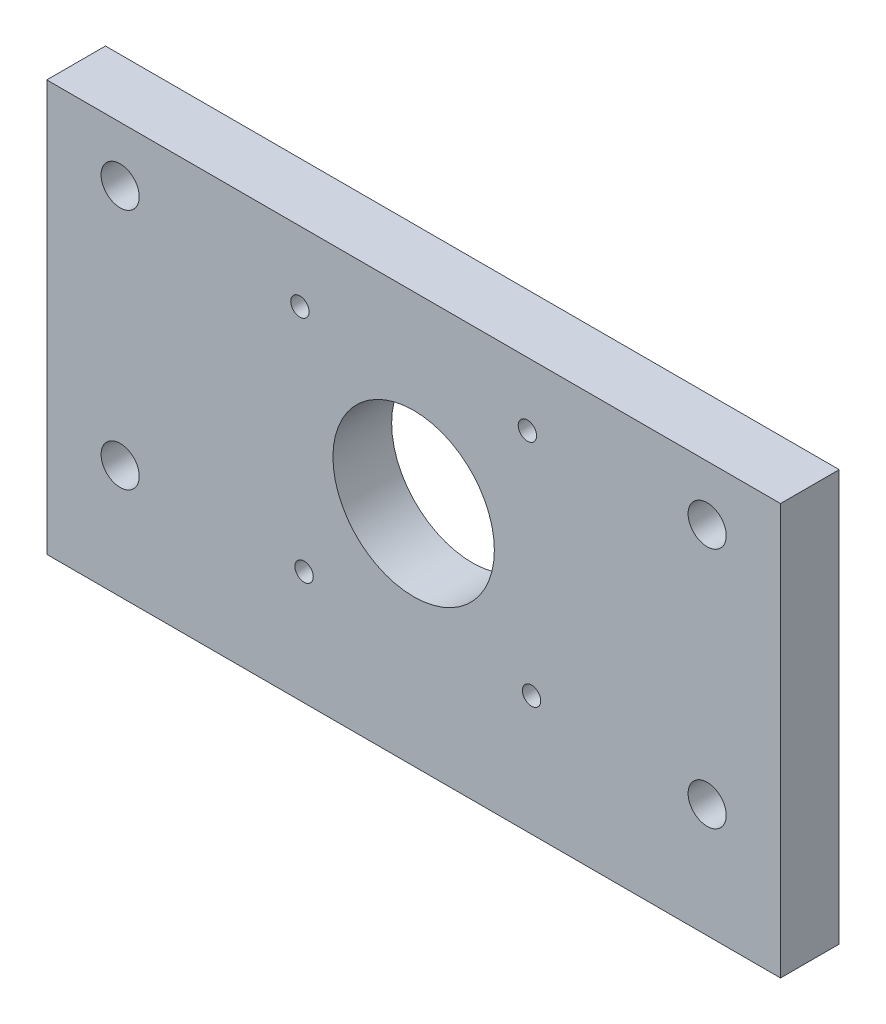
ISO-10303-21;
HEADER;
FILE_DESCRIPTION(('STEP AP214'),'2;1');
FILE_NAME('part.step','',(''),(''),'','','');
FILE_SCHEMA(('AUTOMOTIVE_DESIGN { 1 0 10303 214 1 1 1 1 }'));
ENDSEC;
DATA;
#1=APPLICATION_CONTEXT('core data for automotive mechanical design processes');
#2=APPLICATION_PROTOCOL_DEFINITION('international standard','automotive_design',2000,#1);
#3=PRODUCT_CONTEXT('',#1,'mechanical');
#4=PRODUCT('Part','Part','',(#3));
#5=PRODUCT_RELATED_PRODUCT_CATEGORY('part','',(#4));
#6=PRODUCT_DEFINITION_FORMATION('','',#4);
#7=PRODUCT_DEFINITION_CONTEXT('part definition',#1,'design');
#8=PRODUCT_DEFINITION('design','',#6,#7);
#9=PRODUCT_DEFINITION_SHAPE('','',#8);
#10=(LENGTH_UNIT() NAMED_UNIT(*) SI_UNIT(.MILLI.,.METRE.));
#11=(NAMED_UNIT(*) PLANE_ANGLE_UNIT() SI_UNIT($,.RADIAN.));
#12=(NAMED_UNIT(*) SI_UNIT($,.STERADIAN.) SOLID_ANGLE_UNIT());
#13=UNCERTAINTY_MEASURE_WITH_UNIT(LENGTH_MEASURE(1.E-05),#10,'distance_accuracy_value','');
#14=(GEOMETRIC_REPRESENTATION_CONTEXT(3) GLOBAL_UNCERTAINTY_ASSIGNED_CONTEXT((#13)) GLOBAL_UNIT_ASSIGNED_CONTEXT((#10,
#11,#12)) REPRESENTATION_CONTEXT('',''));
#15=CARTESIAN_POINT('',(0.,0.,0.));
#16=DIRECTION('',(0.,0.,1.));
#17=DIRECTION('',(1.,0.,0.));
#18=AXIS2_PLACEMENT_3D('',#15,#16,#17);
#19=CARTESIAN_POINT('',(0.,0.,8.));
#20=DIRECTION('',(0.,0.,1.));
#21=DIRECTION('',(1.,0.,0.));
#22=AXIS2_PLACEMENT_3D('',#19,#20,#21);
#23=PLANE('',#22);
#24=CARTESIAN_POINT('',(-32.6220828412006,-13.5297723292469,8.));
#25=DIRECTION('',(0.,0.,1.));
#26=DIRECTION('',(1.,0.,0.));
#27=AXIS2_PLACEMENT_3D('',#24,#25,#26);
#28=CIRCLE('',#27,2.59999999999998);
#29=CARTESIAN_POINT('',(-30.0220828412007,-13.5297723292469,8.));
#30=VERTEX_POINT('',#29);
#31=EDGE_CURVE('E306',#30,#30,#28,.T.);
#32=ORIENTED_EDGE('',*,*,#31,.F.);
#33=EDGE_LOOP('',(#32));
#34=FACE_BOUND('',#33,.T.);
#35=CARTESIAN_POINT('',(47.3779171587994,-13.5297723292469,8.));
#36=DIRECTION('',(0.,0.,1.));
#37=DIRECTION('',(1.,0.,0.));
#38=AXIS2_PLACEMENT_3D('',#35,#36,#37);
#39=CIRCLE('',#38,2.59999999999999);
#40=CARTESIAN_POINT('',(49.9779171587994,-13.5297723292469,8.));
#41=VERTEX_POINT('',#40);
#42=EDGE_CURVE('E309',#41,#41,#39,.T.);
#43=ORIENTED_EDGE('',*,*,#42,.F.);
#44=EDGE_LOOP('',(#43));
#45=FACE_BOUND('',#44,.T.);
#46=CARTESIAN_POINT('',(47.3779171587994,19.4702276707531,8.));
#47=DIRECTION('',(0.,0.,1.));
#48=DIRECTION('',(1.,0.,0.));
#49=AXIS2_PLACEMENT_3D('',#46,#47,#48);
#50=CIRCLE('',#49,2.59999999999999);
#51=CARTESIAN_POINT('',(49.9779171587994,19.4702276707531,8.));
#52=VERTEX_POINT('',#51);
#53=EDGE_CURVE('E288',#52,#52,#50,.T.);
#54=ORIENTED_EDGE('',*,*,#53,.F.);
#55=EDGE_LOOP('',(#54));
#56=FACE_BOUND('',#55,.T.);
#57=CARTESIAN_POINT('',(-32.6220828412006,19.4702276707531,8.));
#58=DIRECTION('',(0.,0.,1.));
#59=DIRECTION('',(1.,0.,0.));
#60=AXIS2_PLACEMENT_3D('',#57,#58,#59);
#61=CIRCLE('',#60,2.59999999999998);
#62=CARTESIAN_POINT('',(-30.0220828412007,19.4702276707531,8.));
#63=VERTEX_POINT('',#62);
#64=EDGE_CURVE('E112',#63,#63,#61,.T.);
#65=ORIENTED_EDGE('',*,*,#64,.F.);
#66=EDGE_LOOP('',(#65));
#67=FACE_BOUND('',#66,.T.);
#68=CARTESIAN_POINT('',(22.8779171587994,18.329910511326,8.));
#69=DIRECTION('',(0.,0.,1.));
#70=DIRECTION('',(1.,0.,0.));
#71=AXIS2_PLACEMENT_3D('',#68,#69,#70);
#72=CIRCLE('',#71,1.24999999999999);
#73=CARTESIAN_POINT('',(24.1279171587994,18.329910511326,8.));
#74=VERTEX_POINT('',#73);
#75=EDGE_CURVE('E102',#74,#74,#72,.T.);
#76=ORIENTED_EDGE('',*,*,#75,.F.);
#77=EDGE_LOOP('',(#76));
#78=FACE_BOUND('',#77,.T.);
#79=CARTESIAN_POINT('',(23.4466022773196,-12.670089488674,8.));
#80=DIRECTION('',(0.,0.,1.));
#81=DIRECTION('',(1.,0.,0.));
#82=AXIS2_PLACEMENT_3D('',#79,#80,#81);
#83=CIRCLE('',#82,1.24999999999999);
#84=CARTESIAN_POINT('',(24.6966022773195,-12.670089488674,8.));
#85=VERTEX_POINT('',#84);
#86=EDGE_CURVE('E145',#85,#85,#83,.T.);
#87=ORIENTED_EDGE('',*,*,#86,.F.);
#88=EDGE_LOOP('',(#87));
#89=FACE_BOUND('',#88,.T.);
#90=CARTESIAN_POINT('',(-7.55339772268045,-13.5297723292469,8.));
#91=DIRECTION('',(0.,0.,1.));
#92=DIRECTION('',(1.,0.,0.));
#93=AXIS2_PLACEMENT_3D('',#90,#91,#92);
#94=CIRCLE('',#93,1.24999999999999);
#95=CARTESIAN_POINT('',(-6.30339772268046,-13.5297723292469,8.));
#96=VERTEX_POINT('',#95);
#97=EDGE_CURVE('E142',#96,#96,#94,.T.);
#98=ORIENTED_EDGE('',*,*,#97,.F.);
#99=EDGE_LOOP('',(#98));
#100=FACE_BOUND('',#99,.T.);
#101=CARTESIAN_POINT('',(-8.12208284120064,17.4702276707531,8.));
#102=DIRECTION('',(0.,0.,1.));
#103=DIRECTION('',(1.,0.,0.));
#104=AXIS2_PLACEMENT_3D('',#101,#102,#103);
#105=CIRCLE('',#104,1.24999999999999);
#106=CARTESIAN_POINT('',(-6.87208284120065,17.4702276707531,8.));
#107=VERTEX_POINT('',#106);
#108=EDGE_CURVE('E139',#107,#107,#105,.T.);
#109=ORIENTED_EDGE('',*,*,#108,.F.);
#110=EDGE_LOOP('',(#109));
#111=FACE_BOUND('',#110,.T.);
#112=CARTESIAN_POINT('',(7.37791715879936,1.97022767075305,8.));
#113=DIRECTION('',(0.,0.,1.));
#114=DIRECTION('',(1.,0.,0.));
#115=AXIS2_PLACEMENT_3D('',#112,#113,#114);
#116=CIRCLE('',#115,11.);
#117=CARTESIAN_POINT('',(18.3779171587994,1.97022767075305,8.));
#118=VERTEX_POINT('',#117);
#119=EDGE_CURVE('E135',#118,#118,#116,.T.);
#120=ORIENTED_EDGE('',*,*,#119,.F.);
#121=EDGE_LOOP('',(#120));
#122=FACE_BOUND('',#121,.T.);
#123=DIRECTION('',(0.,-1.,0.));
#124=VECTOR('',#123,1.);
#125=CARTESIAN_POINT('',(-42.6220828412006,26.9702276707531,8.));
#126=LINE('',#125,#124);
#127=CARTESIAN_POINT('',(-42.6220828412006,26.9702276707531,8.));
#128=VERTEX_POINT('',#127);
#129=CARTESIAN_POINT('',(-42.6220828412006,-29.0297723292469,8.));
#130=VERTEX_POINT('',#129);
#131=EDGE_CURVE('E86',#128,#130,#126,.T.);
#132=ORIENTED_EDGE('',*,*,#131,.T.);
#133=DIRECTION('',(1.,0.,0.));
#134=VECTOR('',#133,1.);
#135=CARTESIAN_POINT('',(-42.6220828412006,-29.0297723292469,8.));
#136=LINE('',#135,#134);
#137=CARTESIAN_POINT('',(57.3779171587994,-29.0297723292469,8.));
#138=VERTEX_POINT('',#137);
#139=EDGE_CURVE('E82',#130,#138,#136,.T.);
#140=ORIENTED_EDGE('',*,*,#139,.T.);
#141=DIRECTION('',(0.,1.,0.));
#142=VECTOR('',#141,1.);
#143=CARTESIAN_POINT('',(57.3779171587994,26.9702276707531,8.));
#144=LINE('',#143,#142);
#145=CARTESIAN_POINT('',(57.3779171587994,26.9702276707531,8.));
#146=VERTEX_POINT('',#145);
#147=EDGE_CURVE('E84',#138,#146,#144,.T.);
#148=ORIENTED_EDGE('',*,*,#147,.T.);
#149=DIRECTION('',(-1.,0.,0.));
#150=VECTOR('',#149,1.);
#151=CARTESIAN_POINT('',(-42.6220828412006,26.9702276707531,8.));
#152=LINE('',#151,#150);
#153=EDGE_CURVE('E52',#146,#128,#152,.T.);
#154=ORIENTED_EDGE('',*,*,#153,.T.);
#155=EDGE_LOOP('',(#132,#140,#148,#154));
#156=FACE_BOUND('',#155,.T.);
#157=ADVANCED_FACE('F33',(#34,#45,#56,#67,#78,#89,#100,#111,#122,#156),#23,.T.);
#158=CARTESIAN_POINT('',(0.,0.,0.));
#159=DIRECTION('',(0.,0.,1.));
#160=DIRECTION('',(1.,0.,0.));
#161=AXIS2_PLACEMENT_3D('',#158,#159,#160);
#162=PLANE('',#161);
#163=CARTESIAN_POINT('',(-32.6220828412006,-13.5297723292469,0.));
#164=DIRECTION('',(0.,0.,1.));
#165=DIRECTION('',(1.,0.,0.));
#166=AXIS2_PLACEMENT_3D('',#163,#164,#165);
#167=CIRCLE('',#166,2.59999999999998);
#168=CARTESIAN_POINT('',(-30.0220828412007,-13.5297723292469,0.));
#169=VERTEX_POINT('',#168);
#170=EDGE_CURVE('E37',#169,#169,#167,.T.);
#171=ORIENTED_EDGE('',*,*,#170,.T.);
#172=EDGE_LOOP('',(#171));
#173=FACE_BOUND('',#172,.T.);
#174=CARTESIAN_POINT('',(47.3779171587994,-13.5297723292469,0.));
#175=DIRECTION('',(0.,0.,1.));
#176=DIRECTION('',(1.,0.,0.));
#177=AXIS2_PLACEMENT_3D('',#174,#175,#176);
#178=CIRCLE('',#177,2.59999999999999);
#179=CARTESIAN_POINT('',(49.9779171587994,-13.5297723292469,0.));
#180=VERTEX_POINT('',#179);
#181=EDGE_CURVE('E114',#180,#180,#178,.T.);
#182=ORIENTED_EDGE('',*,*,#181,.T.);
#183=EDGE_LOOP('',(#182));
#184=FACE_BOUND('',#183,.T.);
#185=CARTESIAN_POINT('',(47.3779171587994,19.4702276707531,0.));
#186=DIRECTION('',(0.,0.,1.));
#187=DIRECTION('',(1.,0.,0.));
#188=AXIS2_PLACEMENT_3D('',#185,#186,#187);
#189=CIRCLE('',#188,2.59999999999999);
#190=CARTESIAN_POINT('',(49.9779171587994,19.4702276707531,0.));
#191=VERTEX_POINT('',#190);
#192=EDGE_CURVE('E111',#191,#191,#189,.T.);
#193=ORIENTED_EDGE('',*,*,#192,.T.);
#194=EDGE_LOOP('',(#193));
#195=FACE_BOUND('',#194,.T.);
#196=CARTESIAN_POINT('',(-32.6220828412006,19.4702276707531,0.));
#197=DIRECTION('',(0.,0.,1.));
#198=DIRECTION('',(1.,0.,0.));
#199=AXIS2_PLACEMENT_3D('',#196,#197,#198);
#200=CIRCLE('',#199,2.59999999999998);
#201=CARTESIAN_POINT('',(-30.0220828412007,19.4702276707531,0.));
#202=VERTEX_POINT('',#201);
#203=EDGE_CURVE('E108',#202,#202,#200,.T.);
#204=ORIENTED_EDGE('',*,*,#203,.T.);
#205=EDGE_LOOP('',(#204));
#206=FACE_BOUND('',#205,.T.);
#207=CARTESIAN_POINT('',(22.8779171587994,18.329910511326,0.));
#208=DIRECTION('',(0.,0.,-1.));
#209=DIRECTION('',(-1.,0.,0.));
#210=AXIS2_PLACEMENT_3D('',#207,#208,#209);
#211=CIRCLE('',#210,1.24999999999999);
#212=CARTESIAN_POINT('',(21.6279171587994,18.329910511326,0.));
#213=VERTEX_POINT('',#212);
#214=EDGE_CURVE('E119',#213,#213,#211,.T.);
#215=ORIENTED_EDGE('',*,*,#214,.F.);
#216=EDGE_LOOP('',(#215));
#217=FACE_BOUND('',#216,.T.);
#218=CARTESIAN_POINT('',(23.4466022773196,-12.670089488674,0.));
#219=DIRECTION('',(0.,0.,-1.));
#220=DIRECTION('',(-1.,0.,0.));
#221=AXIS2_PLACEMENT_3D('',#218,#219,#220);
#222=CIRCLE('',#221,1.24999999999999);
#223=CARTESIAN_POINT('',(22.1966022773196,-12.670089488674,0.));
#224=VERTEX_POINT('',#223);
#225=EDGE_CURVE('E123',#224,#224,#222,.T.);
#226=ORIENTED_EDGE('',*,*,#225,.F.);
#227=EDGE_LOOP('',(#226));
#228=FACE_BOUND('',#227,.T.);
#229=CARTESIAN_POINT('',(-7.55339772268045,-13.5297723292469,0.));
#230=DIRECTION('',(0.,0.,-1.));
#231=DIRECTION('',(-1.,0.,0.));
#232=AXIS2_PLACEMENT_3D('',#229,#230,#231);
#233=CIRCLE('',#232,1.24999999999999);
#234=CARTESIAN_POINT('',(-8.80339772268044,-13.5297723292469,0.));
#235=VERTEX_POINT('',#234);
#236=EDGE_CURVE('E128',#235,#235,#233,.T.);
#237=ORIENTED_EDGE('',*,*,#236,.F.);
#238=EDGE_LOOP('',(#237));
#239=FACE_BOUND('',#238,.T.);
#240=CARTESIAN_POINT('',(-8.12208284120064,17.4702276707531,0.));
#241=DIRECTION('',(0.,0.,-1.));
#242=DIRECTION('',(-1.,0.,0.));
#243=AXIS2_PLACEMENT_3D('',#240,#241,#242);
#244=CIRCLE('',#243,1.24999999999999);
#245=CARTESIAN_POINT('',(-9.37208284120063,17.4702276707531,0.));
#246=VERTEX_POINT('',#245);
#247=EDGE_CURVE('E136',#246,#246,#244,.T.);
#248=ORIENTED_EDGE('',*,*,#247,.F.);
#249=EDGE_LOOP('',(#248));
#250=FACE_BOUND('',#249,.T.);
#251=CARTESIAN_POINT('',(7.37791715879936,1.97022767075305,0.));
#252=DIRECTION('',(0.,0.,-1.));
#253=DIRECTION('',(-1.,0.,0.));
#254=AXIS2_PLACEMENT_3D('',#251,#252,#253);
#255=CIRCLE('',#254,11.);
#256=CARTESIAN_POINT('',(-3.62208284120064,1.97022767075305,0.));
#257=VERTEX_POINT('',#256);
#258=EDGE_CURVE('E132',#257,#257,#255,.T.);
#259=ORIENTED_EDGE('',*,*,#258,.F.);
#260=EDGE_LOOP('',(#259));
#261=FACE_BOUND('',#260,.T.);
#262=DIRECTION('',(0.,-1.,0.));
#263=VECTOR('',#262,1.);
#264=CARTESIAN_POINT('',(-42.6220828412006,26.9702276707531,0.));
#265=LINE('',#264,#263);
#266=CARTESIAN_POINT('',(-42.6220828412006,26.9702276707531,0.));
#267=VERTEX_POINT('',#266);
#268=CARTESIAN_POINT('',(-42.6220828412006,-29.0297723292469,0.));
#269=VERTEX_POINT('',#268);
#270=EDGE_CURVE('E99',#267,#269,#265,.T.);
#271=ORIENTED_EDGE('',*,*,#270,.F.);
#272=DIRECTION('',(-1.,0.,0.));
#273=VECTOR('',#272,1.);
#274=CARTESIAN_POINT('',(-42.6220828412006,26.9702276707531,0.));
#275=LINE('',#274,#273);
#276=CARTESIAN_POINT('',(57.3779171587994,26.9702276707531,0.));
#277=VERTEX_POINT('',#276);
#278=EDGE_CURVE('E75',#277,#267,#275,.T.);
#279=ORIENTED_EDGE('',*,*,#278,.F.);
#280=DIRECTION('',(0.,1.,0.));
#281=VECTOR('',#280,1.);
#282=CARTESIAN_POINT('',(57.3779171587994,26.9702276707531,0.));
#283=LINE('',#282,#281);
#284=CARTESIAN_POINT('',(57.3779171587994,-29.0297723292469,0.));
#285=VERTEX_POINT('',#284);
#286=EDGE_CURVE('E69',#285,#277,#283,.T.);
#287=ORIENTED_EDGE('',*,*,#286,.F.);
#288=DIRECTION('',(1.,0.,0.));
#289=VECTOR('',#288,1.);
#290=CARTESIAN_POINT('',(-42.6220828412006,-29.0297723292469,0.));
#291=LINE('',#290,#289);
#292=EDGE_CURVE('E90',#269,#285,#291,.T.);
#293=ORIENTED_EDGE('',*,*,#292,.F.);
#294=EDGE_LOOP('',(#271,#279,#287,#293));
#295=FACE_BOUND('',#294,.T.);
#296=ADVANCED_FACE('F155',(#173,#184,#195,#206,#217,#228,#239,#250,#261,#295),#162,.F.);
#297=CARTESIAN_POINT('',(-42.6220828412006,26.9702276707531,8.));
#298=DIRECTION('',(1.,0.,0.));
#299=DIRECTION('',(0.,0.,-1.));
#300=AXIS2_PLACEMENT_3D('',#297,#298,#299);
#301=PLANE('',#300);
#302=ORIENTED_EDGE('',*,*,#270,.T.);
#303=DIRECTION('',(0.,0.,-1.));
#304=VECTOR('',#303,1.);
#305=CARTESIAN_POINT('',(-42.6220828412006,-29.0297723292469,8.));
#306=LINE('',#305,#304);
#307=EDGE_CURVE('E11',#130,#269,#306,.T.);
#308=ORIENTED_EDGE('',*,*,#307,.F.);
#309=ORIENTED_EDGE('',*,*,#131,.F.);
#310=DIRECTION('',(0.,0.,-1.));
#311=VECTOR('',#310,1.);
#312=CARTESIAN_POINT('',(-42.6220828412006,26.9702276707531,8.));
#313=LINE('',#312,#311);
#314=EDGE_CURVE('E95',#128,#267,#313,.T.);
#315=ORIENTED_EDGE('',*,*,#314,.T.);
#316=EDGE_LOOP('',(#302,#308,#309,#315));
#317=FACE_BOUND('',#316,.T.);
#318=ADVANCED_FACE('F35',(#317),#301,.F.);
#319=CARTESIAN_POINT('',(-42.6220828412006,-29.0297723292469,8.));
#320=DIRECTION('',(0.,1.,0.));
#321=DIRECTION('',(0.,0.,1.));
#322=AXIS2_PLACEMENT_3D('',#319,#320,#321);
#323=PLANE('',#322);
#324=ORIENTED_EDGE('',*,*,#292,.T.);
#325=DIRECTION('',(0.,0.,-1.));
#326=VECTOR('',#325,1.);
#327=CARTESIAN_POINT('',(57.3779171587994,-29.0297723292469,8.));
#328=LINE('',#327,#326);
#329=EDGE_CURVE('E43',#138,#285,#328,.T.);
#330=ORIENTED_EDGE('',*,*,#329,.F.);
#331=ORIENTED_EDGE('',*,*,#139,.F.);
#332=ORIENTED_EDGE('',*,*,#307,.T.);
#333=EDGE_LOOP('',(#324,#330,#331,#332));
#334=FACE_BOUND('',#333,.T.);
#335=ADVANCED_FACE('F89',(#334),#323,.F.);
#336=CARTESIAN_POINT('',(57.3779171587994,26.9702276707531,8.));
#337=DIRECTION('',(-1.,0.,0.));
#338=DIRECTION('',(0.,-1.,0.));
#339=AXIS2_PLACEMENT_3D('',#336,#337,#338);
#340=PLANE('',#339);
#341=ORIENTED_EDGE('',*,*,#286,.T.);
#342=DIRECTION('',(0.,0.,-1.));
#343=VECTOR('',#342,1.);
#344=CARTESIAN_POINT('',(57.3779171587994,26.9702276707531,8.));
#345=LINE('',#344,#343);
#346=EDGE_CURVE('E91',#146,#277,#345,.T.);
#347=ORIENTED_EDGE('',*,*,#346,.F.);
#348=ORIENTED_EDGE('',*,*,#147,.F.);
#349=ORIENTED_EDGE('',*,*,#329,.T.);
#350=EDGE_LOOP('',(#341,#347,#348,#349));
#351=FACE_BOUND('',#350,.T.);
#352=ADVANCED_FACE('F93',(#351),#340,.F.);
#353=CARTESIAN_POINT('',(-42.6220828412006,26.9702276707531,8.));
#354=DIRECTION('',(0.,-1.,0.));
#355=DIRECTION('',(0.,0.,-1.));
#356=AXIS2_PLACEMENT_3D('',#353,#354,#355);
#357=PLANE('',#356);
#358=ORIENTED_EDGE('',*,*,#278,.T.);
#359=ORIENTED_EDGE('',*,*,#314,.F.);
#360=ORIENTED_EDGE('',*,*,#153,.F.);
#361=ORIENTED_EDGE('',*,*,#346,.T.);
#362=EDGE_LOOP('',(#358,#359,#360,#361));
#363=FACE_BOUND('',#362,.T.);
#364=ADVANCED_FACE('F170',(#363),#357,.F.);
#365=CARTESIAN_POINT('',(7.37791715879936,1.97022767075305,10.));
#366=DIRECTION('',(0.,0.,-1.));
#367=DIRECTION('',(-1.,0.,0.));
#368=AXIS2_PLACEMENT_3D('',#365,#366,#367);
#369=CYLINDRICAL_SURFACE('',#368,11.);
#370=ORIENTED_EDGE('',*,*,#119,.T.);
#371=EDGE_LOOP('',(#370));
#372=FACE_BOUND('',#371,.T.);
#373=ORIENTED_EDGE('',*,*,#258,.T.);
#374=EDGE_LOOP('',(#373));
#375=FACE_BOUND('',#374,.T.);
#376=ADVANCED_FACE('F166',(#372,#375),#369,.F.);
#377=CARTESIAN_POINT('',(-8.12208284120064,17.4702276707531,10.));
#378=DIRECTION('',(0.,0.,-1.));
#379=DIRECTION('',(-1.,0.,0.));
#380=AXIS2_PLACEMENT_3D('',#377,#378,#379);
#381=CYLINDRICAL_SURFACE('',#380,1.24999999999999);
#382=ORIENTED_EDGE('',*,*,#108,.T.);
#383=EDGE_LOOP('',(#382));
#384=FACE_BOUND('',#383,.T.);
#385=ORIENTED_EDGE('',*,*,#247,.T.);
#386=EDGE_LOOP('',(#385));
#387=FACE_BOUND('',#386,.T.);
#388=ADVANCED_FACE('F169',(#384,#387),#381,.F.);
#389=CARTESIAN_POINT('',(-7.55339772268045,-13.5297723292469,10.));
#390=DIRECTION('',(0.,0.,-1.));
#391=DIRECTION('',(-1.,0.,0.));
#392=AXIS2_PLACEMENT_3D('',#389,#390,#391);
#393=CYLINDRICAL_SURFACE('',#392,1.24999999999999);
#394=ORIENTED_EDGE('',*,*,#97,.T.);
#395=EDGE_LOOP('',(#394));
#396=FACE_BOUND('',#395,.T.);
#397=ORIENTED_EDGE('',*,*,#236,.T.);
#398=EDGE_LOOP('',(#397));
#399=FACE_BOUND('',#398,.T.);
#400=ADVANCED_FACE('F221',(#396,#399),#393,.F.);
#401=CARTESIAN_POINT('',(23.4466022773196,-12.670089488674,10.));
#402=DIRECTION('',(0.,0.,-1.));
#403=DIRECTION('',(-1.,0.,0.));
#404=AXIS2_PLACEMENT_3D('',#401,#402,#403);
#405=CYLINDRICAL_SURFACE('',#404,1.24999999999999);
#406=ORIENTED_EDGE('',*,*,#86,.T.);
#407=EDGE_LOOP('',(#406));
#408=FACE_BOUND('',#407,.T.);
#409=ORIENTED_EDGE('',*,*,#225,.T.);
#410=EDGE_LOOP('',(#409));
#411=FACE_BOUND('',#410,.T.);
#412=ADVANCED_FACE('F210',(#408,#411),#405,.F.);
#413=CARTESIAN_POINT('',(22.8779171587994,18.329910511326,10.));
#414=DIRECTION('',(0.,0.,-1.));
#415=DIRECTION('',(-1.,0.,0.));
#416=AXIS2_PLACEMENT_3D('',#413,#414,#415);
#417=CYLINDRICAL_SURFACE('',#416,1.24999999999999);
#418=ORIENTED_EDGE('',*,*,#75,.T.);
#419=EDGE_LOOP('',(#418));
#420=FACE_BOUND('',#419,.T.);
#421=ORIENTED_EDGE('',*,*,#214,.T.);
#422=EDGE_LOOP('',(#421));
#423=FACE_BOUND('',#422,.T.);
#424=ADVANCED_FACE('F151',(#420,#423),#417,.F.);
#425=CARTESIAN_POINT('',(-32.6220828412006,19.4702276707531,-2.));
#426=DIRECTION('',(0.,0.,1.));
#427=DIRECTION('',(1.,0.,0.));
#428=AXIS2_PLACEMENT_3D('',#425,#426,#427);
#429=CYLINDRICAL_SURFACE('',#428,2.59999999999998);
#430=ORIENTED_EDGE('',*,*,#64,.T.);
#431=EDGE_LOOP('',(#430));
#432=FACE_BOUND('',#431,.T.);
#433=ORIENTED_EDGE('',*,*,#203,.F.);
#434=EDGE_LOOP('',(#433));
#435=FACE_BOUND('',#434,.T.);
#436=ADVANCED_FACE('F209',(#432,#435),#429,.F.);
#437=CARTESIAN_POINT('',(47.3779171587994,19.4702276707531,-2.));
#438=DIRECTION('',(0.,0.,1.));
#439=DIRECTION('',(1.,0.,0.));
#440=AXIS2_PLACEMENT_3D('',#437,#438,#439);
#441=CYLINDRICAL_SURFACE('',#440,2.59999999999999);
#442=ORIENTED_EDGE('',*,*,#53,.T.);
#443=EDGE_LOOP('',(#442));
#444=FACE_BOUND('',#443,.T.);
#445=ORIENTED_EDGE('',*,*,#192,.F.);
#446=EDGE_LOOP('',(#445));
#447=FACE_BOUND('',#446,.T.);
#448=ADVANCED_FACE('F271',(#444,#447),#441,.F.);
#449=CARTESIAN_POINT('',(47.3779171587994,-13.5297723292469,-2.));
#450=DIRECTION('',(0.,0.,1.));
#451=DIRECTION('',(1.,0.,0.));
#452=AXIS2_PLACEMENT_3D('',#449,#450,#451);
#453=CYLINDRICAL_SURFACE('',#452,2.59999999999999);
#454=ORIENTED_EDGE('',*,*,#42,.T.);
#455=EDGE_LOOP('',(#454));
#456=FACE_BOUND('',#455,.T.);
#457=ORIENTED_EDGE('',*,*,#181,.F.);
#458=EDGE_LOOP('',(#457));
#459=FACE_BOUND('',#458,.T.);
#460=ADVANCED_FACE('F276',(#456,#459),#453,.F.);
#461=CARTESIAN_POINT('',(-32.6220828412006,-13.5297723292469,-2.));
#462=DIRECTION('',(0.,0.,1.));
#463=DIRECTION('',(1.,0.,0.));
#464=AXIS2_PLACEMENT_3D('',#461,#462,#463);
#465=CYLINDRICAL_SURFACE('',#464,2.59999999999998);
#466=ORIENTED_EDGE('',*,*,#31,.T.);
#467=EDGE_LOOP('',(#466));
#468=FACE_BOUND('',#467,.T.);
#469=ORIENTED_EDGE('',*,*,#170,.F.);
#470=EDGE_LOOP('',(#469));
#471=FACE_BOUND('',#470,.T.);
#472=ADVANCED_FACE('F273',(#468,#471),#465,.F.);
#473=CLOSED_SHELL('',(#157,#296,#318,#335,#352,#364,#376,#388,#400,#412,#424,#436,#448,#460,#472));
#474=MANIFOLD_SOLID_BREP('B2',#473);
#475=ADVANCED_BREP_SHAPE_REPRESENTATION('',(#18,#474),#14);
#476=SHAPE_DEFINITION_REPRESENTATION(#9,#475);
ENDSEC;
END-ISO-10303-21;
